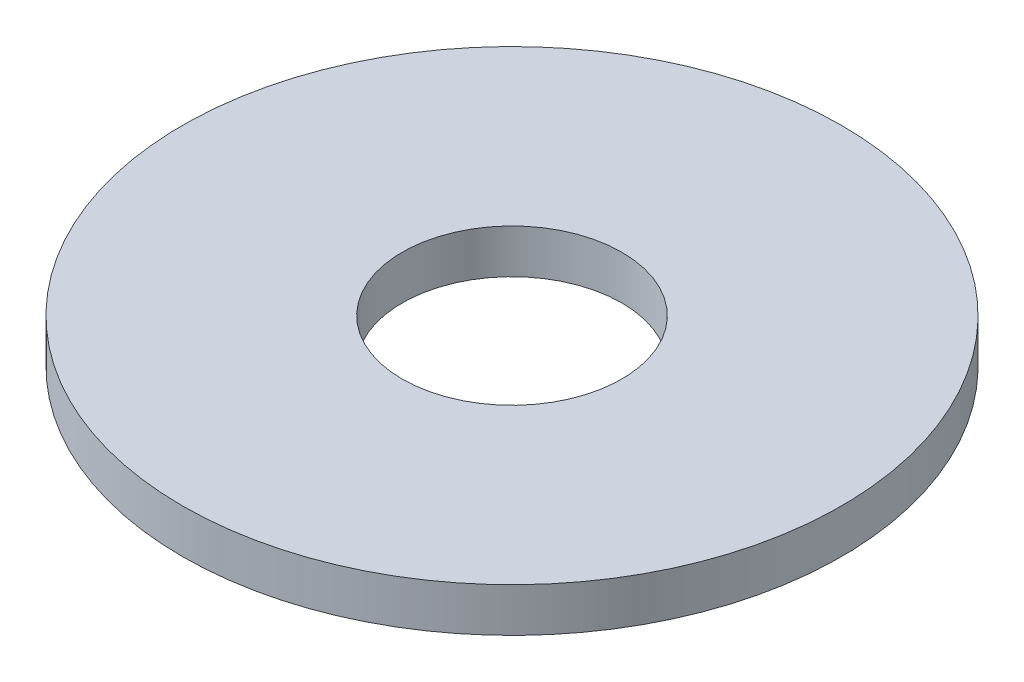
ISO-10303-21;
HEADER;
FILE_DESCRIPTION(('STEP AP214'),'2;1');
FILE_NAME('part.step','',(''),(''),'','','');
FILE_SCHEMA(('AUTOMOTIVE_DESIGN { 1 0 10303 214 1 1 1 1 }'));
ENDSEC;
DATA;
#1=APPLICATION_CONTEXT('core data for automotive mechanical design processes');
#2=APPLICATION_PROTOCOL_DEFINITION('international standard','automotive_design',2000,#1);
#3=PRODUCT_CONTEXT('',#1,'mechanical');
#4=PRODUCT('Part','Part','',(#3));
#5=PRODUCT_RELATED_PRODUCT_CATEGORY('part','',(#4));
#6=PRODUCT_DEFINITION_FORMATION('','',#4);
#7=PRODUCT_DEFINITION_CONTEXT('part definition',#1,'design');
#8=PRODUCT_DEFINITION('design','',#6,#7);
#9=PRODUCT_DEFINITION_SHAPE('','',#8);
#10=(LENGTH_UNIT() NAMED_UNIT(*) SI_UNIT(.MILLI.,.METRE.));
#11=(NAMED_UNIT(*) PLANE_ANGLE_UNIT() SI_UNIT($,.RADIAN.));
#12=(NAMED_UNIT(*) SI_UNIT($,.STERADIAN.) SOLID_ANGLE_UNIT());
#13=UNCERTAINTY_MEASURE_WITH_UNIT(LENGTH_MEASURE(1.E-05),#10,'distance_accuracy_value','');
#14=(GEOMETRIC_REPRESENTATION_CONTEXT(3) GLOBAL_UNCERTAINTY_ASSIGNED_CONTEXT((#13)) GLOBAL_UNIT_ASSIGNED_CONTEXT((#10,
#11,#12)) REPRESENTATION_CONTEXT('',''));
#15=CARTESIAN_POINT('',(0.,0.,0.));
#16=DIRECTION('',(0.,0.,1.));
#17=DIRECTION('',(1.,0.,0.));
#18=AXIS2_PLACEMENT_3D('',#15,#16,#17);
#19=CARTESIAN_POINT('',(0.,1.,0.));
#20=DIRECTION('',(0.,1.,0.));
#21=DIRECTION('',(0.,0.,1.));
#22=AXIS2_PLACEMENT_3D('',#19,#20,#21);
#23=PLANE('',#22);
#24=CARTESIAN_POINT('',(0.,1.,0.));
#25=DIRECTION('',(0.,1.,0.));
#26=DIRECTION('',(0.,0.,1.));
#27=AXIS2_PLACEMENT_3D('',#24,#25,#26);
#28=CIRCLE('',#27,15.);
#29=CARTESIAN_POINT('',(0.,1.,15.));
#30=VERTEX_POINT('',#29);
#31=EDGE_CURVE('E10',#30,#30,#28,.T.);
#32=ORIENTED_EDGE('',*,*,#31,.T.);
#33=EDGE_LOOP('',(#32));
#34=FACE_BOUND('',#33,.T.);
#35=CARTESIAN_POINT('',(0.,1.,0.));
#36=DIRECTION('',(0.,1.,0.));
#37=DIRECTION('',(0.,0.,1.));
#38=AXIS2_PLACEMENT_3D('',#35,#36,#37);
#39=CIRCLE('',#38,5.);
#40=CARTESIAN_POINT('',(0.,1.,5.));
#41=VERTEX_POINT('',#40);
#42=EDGE_CURVE('E42',#41,#41,#39,.T.);
#43=ORIENTED_EDGE('',*,*,#42,.F.);
#44=EDGE_LOOP('',(#43));
#45=FACE_BOUND('',#44,.T.);
#46=ADVANCED_FACE('F31',(#34,#45),#23,.T.);
#47=CARTESIAN_POINT('',(0.,-1.,0.));
#48=DIRECTION('',(0.,1.,0.));
#49=DIRECTION('',(0.,0.,1.));
#50=AXIS2_PLACEMENT_3D('',#47,#48,#49);
#51=PLANE('',#50);
#52=CARTESIAN_POINT('',(0.,-1.,0.));
#53=DIRECTION('',(0.,1.,0.));
#54=DIRECTION('',(0.,0.,1.));
#55=AXIS2_PLACEMENT_3D('',#52,#53,#54);
#56=CIRCLE('',#55,15.);
#57=CARTESIAN_POINT('',(0.,-1.,15.));
#58=VERTEX_POINT('',#57);
#59=EDGE_CURVE('E35',#58,#58,#56,.T.);
#60=ORIENTED_EDGE('',*,*,#59,.F.);
#61=EDGE_LOOP('',(#60));
#62=FACE_BOUND('',#61,.T.);
#63=CARTESIAN_POINT('',(0.,-1.,0.));
#64=DIRECTION('',(0.,1.,0.));
#65=DIRECTION('',(0.,0.,1.));
#66=AXIS2_PLACEMENT_3D('',#63,#64,#65);
#67=CIRCLE('',#66,5.);
#68=CARTESIAN_POINT('',(0.,-1.,5.));
#69=VERTEX_POINT('',#68);
#70=EDGE_CURVE('E44',#69,#69,#67,.T.);
#71=ORIENTED_EDGE('',*,*,#70,.T.);
#72=EDGE_LOOP('',(#71));
#73=FACE_BOUND('',#72,.T.);
#74=ADVANCED_FACE('F54',(#62,#73),#51,.F.);
#75=CARTESIAN_POINT('',(0.,1.,0.));
#76=DIRECTION('',(0.,-1.,0.));
#77=DIRECTION('',(0.,0.,-1.));
#78=AXIS2_PLACEMENT_3D('',#75,#76,#77);
#79=CYLINDRICAL_SURFACE('',#78,15.);
#80=ORIENTED_EDGE('',*,*,#31,.F.);
#81=EDGE_LOOP('',(#80));
#82=FACE_BOUND('',#81,.T.);
#83=ORIENTED_EDGE('',*,*,#59,.T.);
#84=EDGE_LOOP('',(#83));
#85=FACE_BOUND('',#84,.T.);
#86=ADVANCED_FACE('F33',(#82,#85),#79,.T.);
#87=CARTESIAN_POINT('',(0.,1.,0.));
#88=DIRECTION('',(0.,-1.,0.));
#89=DIRECTION('',(0.,0.,-1.));
#90=AXIS2_PLACEMENT_3D('',#87,#88,#89);
#91=CYLINDRICAL_SURFACE('',#90,5.);
#92=ORIENTED_EDGE('',*,*,#42,.T.);
#93=EDGE_LOOP('',(#92));
#94=FACE_BOUND('',#93,.T.);
#95=ORIENTED_EDGE('',*,*,#70,.F.);
#96=EDGE_LOOP('',(#95));
#97=FACE_BOUND('',#96,.T.);
#98=ADVANCED_FACE('F50',(#94,#97),#91,.F.);
#99=CLOSED_SHELL('',(#46,#74,#86,#98));
#100=MANIFOLD_SOLID_BREP('B2',#99);
#101=ADVANCED_BREP_SHAPE_REPRESENTATION('',(#18,#100),#14);
#102=SHAPE_DEFINITION_REPRESENTATION(#9,#101);
ENDSEC;
END-ISO-10303-21;
